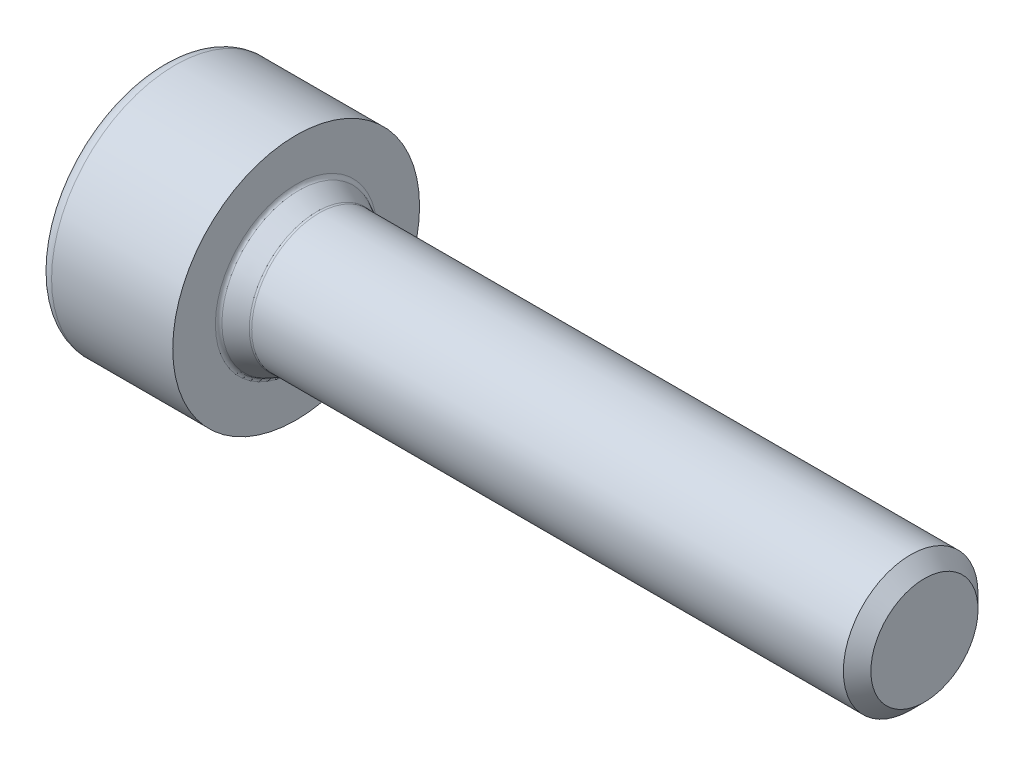
ISO-10303-21;
HEADER;
FILE_DESCRIPTION(('STEP AP214'),'2;1');
FILE_NAME('part.step','',(''),(''),'','','');
FILE_SCHEMA(('AUTOMOTIVE_DESIGN { 1 0 10303 214 1 1 1 1 }'));
ENDSEC;
DATA;
#1=APPLICATION_CONTEXT('core data for automotive mechanical design processes');
#2=APPLICATION_PROTOCOL_DEFINITION('international standard','automotive_design',2000,#1);
#3=PRODUCT_CONTEXT('',#1,'mechanical');
#4=PRODUCT('Part','Part','',(#3));
#5=PRODUCT_RELATED_PRODUCT_CATEGORY('part','',(#4));
#6=PRODUCT_DEFINITION_FORMATION('','',#4);
#7=PRODUCT_DEFINITION_CONTEXT('part definition',#1,'design');
#8=PRODUCT_DEFINITION('design','',#6,#7);
#9=PRODUCT_DEFINITION_SHAPE('','',#8);
#10=(LENGTH_UNIT() NAMED_UNIT(*) SI_UNIT(.MILLI.,.METRE.));
#11=(NAMED_UNIT(*) PLANE_ANGLE_UNIT() SI_UNIT($,.RADIAN.));
#12=(NAMED_UNIT(*) SI_UNIT($,.STERADIAN.) SOLID_ANGLE_UNIT());
#13=UNCERTAINTY_MEASURE_WITH_UNIT(LENGTH_MEASURE(1.E-05),#10,'distance_accuracy_value','');
#14=(GEOMETRIC_REPRESENTATION_CONTEXT(3) GLOBAL_UNCERTAINTY_ASSIGNED_CONTEXT((#13)) GLOBAL_UNIT_ASSIGNED_CONTEXT((#10,
#11,#12)) REPRESENTATION_CONTEXT('',''));
#15=CARTESIAN_POINT('',(0.,0.,0.));
#16=DIRECTION('',(0.,0.,1.));
#17=DIRECTION('',(1.,0.,0.));
#18=AXIS2_PLACEMENT_3D('',#15,#16,#17);
#19=CARTESIAN_POINT('',(-2.906936506234,0.,0.));
#20=DIRECTION('',(-1.,0.,0.));
#21=DIRECTION('',(0.,1.,0.));
#22=AXIS2_PLACEMENT_3D('',#19,#20,#21);
#23=CONICAL_SURFACE('',#22,1.341936506234,0.7853981633973);
#24=CARTESIAN_POINT('',(-3.,0.,0.));
#25=DIRECTION('',(1.,0.,0.));
#26=DIRECTION('',(0.,0.999947983062032,0.0101995671561903));
#27=AXIS2_PLACEMENT_3D('',#24,#25,#26);
#28=CIRCLE('',#27,1.435);
#29=CARTESIAN_POINT('',(-2.99999999999997,1.43492535569397,0.0146363788690873));
#30=VERTEX_POINT('',#29);
#31=CARTESIAN_POINT('',(-3.00000000000003,0.730138153767151,1.23536362113084));
#32=VERTEX_POINT('',#31);
#33=EDGE_CURVE('E39',#30,#32,#28,.T.);
#34=ORIENTED_EDGE('',*,*,#33,.F.);
#35=CARTESIAN_POINT('',(-2.99999999999994,1.43492535569392,0.0146363788691689));
#36=CARTESIAN_POINT('',(-2.97614422371731,1.4106193387093,0.0567356352161698));
#37=CARTESIAN_POINT('',(-2.95372895412203,1.3859120209074,0.0995299649677996));
#38=CARTESIAN_POINT('',(-2.91275824022247,1.33556014658678,0.186741969547446));
#39=CARTESIAN_POINT('',(-2.89422444683699,1.30991122427724,0.231167206146955));
#40=CARTESIAN_POINT('',(-2.86251893335503,1.25819744031708,0.320738107417589));
#41=CARTESIAN_POINT('',(-2.84927080540438,1.23214462501469,0.365862907201519));
#42=CARTESIAN_POINT('',(-2.82890288182361,1.17948997052263,0.457063444036758));
#43=CARTESIAN_POINT('',(-2.8217687788494,1.15288956308333,0.503136701223658));
#44=CARTESIAN_POINT('',(-2.81531818802178,1.10662680515254,0.583266148458035));
#45=CARTESIAN_POINT('',(-2.81441787119777,1.08701763674572,0.61723022443282));
#46=CARTESIAN_POINT('',(-2.81631201720629,1.0478383652373,0.685090713288938));
#47=CARTESIAN_POINT('',(-2.81910735787764,1.02826827252343,0.718987108178199));
#48=CARTESIAN_POINT('',(-2.82823104116125,0.989322680674852,0.786442851990769));
#49=CARTESIAN_POINT('',(-2.83456230528465,0.969947355958469,0.820001898812687));
#50=CARTESIAN_POINT('',(-2.85041837521561,0.93152258447923,0.886555555283951));
#51=CARTESIAN_POINT('',(-2.85994451238738,0.912473277057983,0.919549923586548));
#52=CARTESIAN_POINT('',(-2.88717720356657,0.865404269275559,1.00107583652756));
#53=CARTESIAN_POINT('',(-2.90659584019148,0.837635822931904,1.04917219644202));
#54=CARTESIAN_POINT('',(-2.95013015718396,0.783131175530099,1.14357701499056));
#55=CARTESIAN_POINT('',(-2.97423015988034,0.756391876451996,1.18989083955262));
#56=CARTESIAN_POINT('',(-2.99999999999998,0.730138153766981,1.23536362113088));
#57=B_SPLINE_CURVE_WITH_KNOTS('',3,(#35,#36,#37,#38,#39,#40,#41,#42,#43,#44,#45,#46,#47,#48,#49,
#50,#51,#52,#53,#54,#55,#56),.UNSPECIFIED.,.F.,.F.,(4,2,2,2,2,2,2,2,2,2,4),(0.,0.16255676109417,
0.325997439622727,0.486981513142126,0.647587833358023,0.765107082730972,0.882654251762948,
1.00029868661831,1.11799220718218,1.29422884383595,1.46988514298333),.UNSPECIFIED.);
#58=EDGE_CURVE('E11',#30,#32,#57,.T.);
#59=ORIENTED_EDGE('',*,*,#58,.T.);
#60=EDGE_LOOP('',(#34,#59));
#61=FACE_BOUND('',#60,.T.);
#62=ADVANCED_FACE('F17',(#61),#23,.F.);
#63=CARTESIAN_POINT('',(-1.15,1.443375672974,0.));
#64=DIRECTION('',(0.,0.866025403784429,0.500000000000017));
#65=DIRECTION('',(0.,0.500000000000017,-0.866025403784429));
#66=AXIS2_PLACEMENT_3D('',#63,#64,#65);
#67=PLANE('',#66);
#68=DIRECTION('',(1.,0.,0.));
#69=VECTOR('',#68,1.);
#70=CARTESIAN_POINT('',(-3.,1.443375672974,0.));
#71=LINE('',#70,#69);
#72=CARTESIAN_POINT('',(-3.,1.443375672974,0.));
#73=VERTEX_POINT('',#72);
#74=CARTESIAN_POINT('',(-1.15,1.443375672974,0.));
#75=VERTEX_POINT('',#74);
#76=EDGE_CURVE('E32',#73,#75,#71,.T.);
#77=ORIENTED_EDGE('',*,*,#76,.T.);
#78=DIRECTION('',(0.,0.500000000000017,-0.866025403784429));
#79=VECTOR('',#78,1.);
#80=CARTESIAN_POINT('',(-1.15,0.721687836487,1.25));
#81=LINE('',#80,#79);
#82=CARTESIAN_POINT('',(-1.15,0.721687836487,1.25));
#83=VERTEX_POINT('',#82);
#84=EDGE_CURVE('E321',#83,#75,#81,.T.);
#85=ORIENTED_EDGE('',*,*,#84,.F.);
#86=DIRECTION('',(1.,0.,0.));
#87=VECTOR('',#86,1.);
#88=CARTESIAN_POINT('',(-3.,0.721687836487,1.25));
#89=LINE('',#88,#87);
#90=CARTESIAN_POINT('',(-3.,0.721687836487,1.25));
#91=VERTEX_POINT('',#90);
#92=EDGE_CURVE('E261',#91,#83,#89,.T.);
#93=ORIENTED_EDGE('',*,*,#92,.F.);
#94=DIRECTION('',(0.,-0.500000000002111,0.86602540378322));
#95=VECTOR('',#94,1.);
#96=CARTESIAN_POINT('',(-3.,0.7301381537672,1.235363621131));
#97=LINE('',#96,#95);
#98=EDGE_CURVE('E264',#32,#91,#97,.T.);
#99=ORIENTED_EDGE('',*,*,#98,.F.);
#100=ORIENTED_EDGE('',*,*,#58,.F.);
#101=DIRECTION('',(0.,-0.499999999997804,0.866025403785707));
#102=VECTOR('',#101,1.);
#103=CARTESIAN_POINT('',(-3.,1.443375672974,0.));
#104=LINE('',#103,#102);
#105=EDGE_CURVE('E245',#73,#30,#104,.T.);
#106=ORIENTED_EDGE('',*,*,#105,.F.);
#107=EDGE_LOOP('',(#77,#85,#93,#99,#100,#106));
#108=FACE_BOUND('',#107,.T.);
#109=ADVANCED_FACE('F136',(#108),#67,.F.);
#110=CARTESIAN_POINT('',(-3.,1.9425,0.));
#111=DIRECTION('',(-1.,0.,0.));
#112=DIRECTION('',(0.,1.,0.));
#113=AXIS2_PLACEMENT_3D('',#110,#111,#112);
#114=PLANE('',#113);
#115=CARTESIAN_POINT('',(-3.,0.,0.));
#116=DIRECTION('',(-1.,0.,0.));
#117=DIRECTION('',(0.,0.,-1.));
#118=AXIS2_PLACEMENT_3D('',#115,#116,#117);
#119=CIRCLE('',#118,2.45);
#120=CARTESIAN_POINT('',(-3.,0.,-2.45));
#121=VERTEX_POINT('',#120);
#122=EDGE_CURVE('E220',#121,#121,#119,.T.);
#123=ORIENTED_EDGE('',*,*,#122,.T.);
#124=EDGE_LOOP('',(#123));
#125=FACE_BOUND('',#124,.T.);
#126=DIRECTION('',(0.,-1.,2.469989252602E-12));
#127=VECTOR('',#126,1.);
#128=CARTESIAN_POINT('',(-3.,-0.7047872019268,-1.25));
#129=LINE('',#128,#127);
#130=CARTESIAN_POINT('',(-3.00000000000003,-0.704787201926908,-1.25));
#131=VERTEX_POINT('',#130);
#132=CARTESIAN_POINT('',(-3.,-0.721687836487,-1.25));
#133=VERTEX_POINT('',#132);
#134=EDGE_CURVE('E96',#131,#133,#129,.T.);
#135=ORIENTED_EDGE('',*,*,#134,.F.);
#136=CARTESIAN_POINT('',(-3.,0.,0.));
#137=DIRECTION('',(1.,0.,0.));
#138=DIRECTION('',(0.,-0.491140907266199,-0.871080139372799));
#139=AXIS2_PLACEMENT_3D('',#136,#137,#138);
#140=CIRCLE('',#139,1.435);
#141=CARTESIAN_POINT('',(-3.,0.70478720192687,-1.25000000000002));
#142=VERTEX_POINT('',#141);
#143=EDGE_CURVE('E223',#131,#142,#140,.T.);
#144=ORIENTED_EDGE('',*,*,#143,.T.);
#145=DIRECTION('',(0.,-1.,-2.430574530486E-12));
#146=VECTOR('',#145,1.);
#147=CARTESIAN_POINT('',(-3.,0.721687836487,-1.25));
#148=LINE('',#147,#146);
#149=CARTESIAN_POINT('',(-3.,0.721687836487,-1.25));
#150=VERTEX_POINT('',#149);
#151=EDGE_CURVE('E224',#150,#142,#148,.T.);
#152=ORIENTED_EDGE('',*,*,#151,.F.);
#153=DIRECTION('',(0.,0.500000000002111,0.86602540378322));
#154=VECTOR('',#153,1.);
#155=CARTESIAN_POINT('',(-3.,0.721687836487,-1.25));
#156=LINE('',#155,#154);
#157=CARTESIAN_POINT('',(-3.,0.730138153767082,-1.23536362113086));
#158=VERTEX_POINT('',#157);
#159=EDGE_CURVE('E227',#150,#158,#156,.T.);
#160=ORIENTED_EDGE('',*,*,#159,.T.);
#161=CARTESIAN_POINT('',(-3.,0.,0.));
#162=DIRECTION('',(1.,0.,0.));
#163=DIRECTION('',(0.,0.508807075795911,-0.860880572216619));
#164=AXIS2_PLACEMENT_3D('',#161,#162,#163);
#165=CIRCLE('',#164,1.435);
#166=CARTESIAN_POINT('',(-3.,1.434925355694,-0.0146363788691958));
#167=VERTEX_POINT('',#166);
#168=EDGE_CURVE('E238',#158,#167,#165,.T.);
#169=ORIENTED_EDGE('',*,*,#168,.T.);
#170=DIRECTION('',(0.,0.499999999997804,0.866025403785707));
#171=VECTOR('',#170,1.);
#172=CARTESIAN_POINT('',(-3.,1.434925355694,-0.01463637886925));
#173=LINE('',#172,#171);
#174=EDGE_CURVE('E241',#167,#73,#173,.T.);
#175=ORIENTED_EDGE('',*,*,#174,.T.);
#176=ORIENTED_EDGE('',*,*,#105,.T.);
#177=ORIENTED_EDGE('',*,*,#33,.T.);
#178=ORIENTED_EDGE('',*,*,#98,.T.);
#179=DIRECTION('',(0.,1.,-2.469989252602E-12));
#180=VECTOR('',#179,1.);
#181=CARTESIAN_POINT('',(-3.,0.7047872019268,1.25));
#182=LINE('',#181,#180);
#183=CARTESIAN_POINT('',(-3.00000000000003,0.704787201926908,1.25));
#184=VERTEX_POINT('',#183);
#185=EDGE_CURVE('E257',#184,#91,#182,.T.);
#186=ORIENTED_EDGE('',*,*,#185,.F.);
#187=CARTESIAN_POINT('',(-3.,0.,0.));
#188=DIRECTION('',(1.,0.,0.));
#189=DIRECTION('',(0.,0.491140907266199,0.871080139372799));
#190=AXIS2_PLACEMENT_3D('',#187,#188,#189);
#191=CIRCLE('',#190,1.435);
#192=CARTESIAN_POINT('',(-3.,-0.704787201926871,1.25000000000002));
#193=VERTEX_POINT('',#192);
#194=EDGE_CURVE('E253',#184,#193,#191,.T.);
#195=ORIENTED_EDGE('',*,*,#194,.T.);
#196=DIRECTION('',(0.,1.,2.417436289781E-12));
#197=VECTOR('',#196,1.);
#198=CARTESIAN_POINT('',(-3.,-0.721687836487,1.25));
#199=LINE('',#198,#197);
#200=CARTESIAN_POINT('',(-3.,-0.721687836487,1.25));
#201=VERTEX_POINT('',#200);
#202=EDGE_CURVE('E265',#201,#193,#199,.T.);
#203=ORIENTED_EDGE('',*,*,#202,.F.);
#204=DIRECTION('',(0.,-0.500000000002111,-0.86602540378322));
#205=VECTOR('',#204,1.);
#206=CARTESIAN_POINT('',(-3.,-0.721687836487,1.25));
#207=LINE('',#206,#205);
#208=CARTESIAN_POINT('',(-3.,-0.730138153767082,1.23536362113086));
#209=VERTEX_POINT('',#208);
#210=EDGE_CURVE('E249',#201,#209,#207,.T.);
#211=ORIENTED_EDGE('',*,*,#210,.T.);
#212=CARTESIAN_POINT('',(-3.,0.,0.));
#213=DIRECTION('',(1.,0.,0.));
#214=DIRECTION('',(0.,-0.508807075795911,0.860880572216619));
#215=AXIS2_PLACEMENT_3D('',#212,#213,#214);
#216=CIRCLE('',#215,1.435);
#217=CARTESIAN_POINT('',(-3.,-1.434925355694,0.0146363788691958));
#218=VERTEX_POINT('',#217);
#219=EDGE_CURVE('E246',#209,#218,#216,.T.);
#220=ORIENTED_EDGE('',*,*,#219,.T.);
#221=DIRECTION('',(0.,-0.499999999997804,-0.866025403785707));
#222=VECTOR('',#221,1.);
#223=CARTESIAN_POINT('',(-3.,-1.434925355694,0.01463637886925));
#224=LINE('',#223,#222);
#225=CARTESIAN_POINT('',(-3.,-1.443375672974,0.));
#226=VERTEX_POINT('',#225);
#227=EDGE_CURVE('E250',#218,#226,#224,.T.);
#228=ORIENTED_EDGE('',*,*,#227,.T.);
#229=DIRECTION('',(0.,0.499999999997804,-0.866025403785707));
#230=VECTOR('',#229,1.);
#231=CARTESIAN_POINT('',(-3.,-1.443375672974,0.));
#232=LINE('',#231,#230);
#233=CARTESIAN_POINT('',(-3.,-1.434925355694,-0.0146363788690752));
#234=VERTEX_POINT('',#233);
#235=EDGE_CURVE('E256',#226,#234,#232,.T.);
#236=ORIENTED_EDGE('',*,*,#235,.T.);
#237=CARTESIAN_POINT('',(-3.,0.,0.));
#238=DIRECTION('',(1.,0.,0.));
#239=DIRECTION('',(0.,-0.999947983062032,-0.0101995671561903));
#240=AXIS2_PLACEMENT_3D('',#237,#238,#239);
#241=CIRCLE('',#240,1.435);
#242=CARTESIAN_POINT('',(-3.,-0.730138153767165,-1.23536362113081));
#243=VERTEX_POINT('',#242);
#244=EDGE_CURVE('E79',#234,#243,#241,.T.);
#245=ORIENTED_EDGE('',*,*,#244,.T.);
#246=DIRECTION('',(0.,0.500000000002111,-0.86602540378322));
#247=VECTOR('',#246,1.);
#248=CARTESIAN_POINT('',(-3.,-0.7301381537672,-1.235363621131));
#249=LINE('',#248,#247);
#250=EDGE_CURVE('E89',#243,#133,#249,.T.);
#251=ORIENTED_EDGE('',*,*,#250,.T.);
#252=EDGE_LOOP('',(#135,#144,#152,#160,#169,#175,#176,#177,#178,#186,#195,#203,#211,#220,#228,
#236,#245,#251));
#253=FACE_BOUND('',#252,.T.);
#254=ADVANCED_FACE('F141',(#125,#253),#114,.T.);
#255=CARTESIAN_POINT('',(-2.7,0.,0.));
#256=DIRECTION('',(-1.,0.,0.));
#257=DIRECTION('',(0.,0.,1.));
#258=AXIS2_PLACEMENT_3D('',#255,#256,#257);
#259=TOROIDAL_SURFACE('',#258,2.45,0.3);
#260=CARTESIAN_POINT('',(-2.7,0.,0.));
#261=DIRECTION('',(-1.,0.,0.));
#262=DIRECTION('',(0.,0.,1.));
#263=AXIS2_PLACEMENT_3D('',#260,#261,#262);
#264=CIRCLE('',#263,2.75);
#265=CARTESIAN_POINT('',(-2.7,0.,2.75));
#266=VERTEX_POINT('',#265);
#267=EDGE_CURVE('E503',#266,#266,#264,.T.);
#268=ORIENTED_EDGE('',*,*,#267,.T.);
#269=EDGE_LOOP('',(#268));
#270=FACE_BOUND('',#269,.T.);
#271=ORIENTED_EDGE('',*,*,#122,.F.);
#272=EDGE_LOOP('',(#271));
#273=FACE_BOUND('',#272,.T.);
#274=ADVANCED_FACE('F209',(#270,#273),#259,.T.);
#275=CARTESIAN_POINT('',(-1.35,0.,0.));
#276=DIRECTION('',(1.,0.,0.));
#277=DIRECTION('',(0.,1.,0.));
#278=AXIS2_PLACEMENT_3D('',#275,#276,#277);
#279=CYLINDRICAL_SURFACE('',#278,2.75);
#280=CARTESIAN_POINT('',(0.,0.,0.));
#281=DIRECTION('',(1.,0.,0.));
#282=DIRECTION('',(0.,1.,0.));
#283=AXIS2_PLACEMENT_3D('',#280,#281,#282);
#284=CIRCLE('',#283,2.75);
#285=CARTESIAN_POINT('',(0.,2.75,0.));
#286=VERTEX_POINT('',#285);
#287=EDGE_CURVE('E506',#286,#286,#284,.T.);
#288=ORIENTED_EDGE('',*,*,#287,.F.);
#289=EDGE_LOOP('',(#288));
#290=FACE_BOUND('',#289,.T.);
#291=ORIENTED_EDGE('',*,*,#267,.F.);
#292=EDGE_LOOP('',(#291));
#293=FACE_BOUND('',#292,.T.);
#294=ADVANCED_FACE('F205',(#290,#293),#279,.T.);
#295=CARTESIAN_POINT('',(0.,2.275,0.));
#296=DIRECTION('',(1.,0.,0.));
#297=DIRECTION('',(0.,-1.,0.));
#298=AXIS2_PLACEMENT_3D('',#295,#296,#297);
#299=PLANE('',#298);
#300=ORIENTED_EDGE('',*,*,#287,.T.);
#301=EDGE_LOOP('',(#300));
#302=FACE_BOUND('',#301,.T.);
#303=CARTESIAN_POINT('',(0.,0.,0.));
#304=DIRECTION('',(-1.,0.,0.));
#305=DIRECTION('',(0.,0.,-1.));
#306=AXIS2_PLACEMENT_3D('',#303,#304,#305);
#307=CIRCLE('',#306,1.8);
#308=CARTESIAN_POINT('',(0.,0.,-1.8));
#309=VERTEX_POINT('',#308);
#310=EDGE_CURVE('E509',#309,#309,#307,.T.);
#311=ORIENTED_EDGE('',*,*,#310,.T.);
#312=EDGE_LOOP('',(#311));
#313=FACE_BOUND('',#312,.T.);
#314=ADVANCED_FACE('F201',(#302,#313),#299,.T.);
#315=CARTESIAN_POINT('',(0.1,0.,0.));
#316=DIRECTION('',(-1.,0.,0.));
#317=DIRECTION('',(0.,0.,1.));
#318=AXIS2_PLACEMENT_3D('',#315,#316,#317);
#319=TOROIDAL_SURFACE('',#318,1.8,0.1);
#320=CARTESIAN_POINT('',(0.05615763679786,0.,0.));
#321=DIRECTION('',(-1.,0.,0.));
#322=DIRECTION('',(0.,0.,1.));
#323=AXIS2_PLACEMENT_3D('',#320,#321,#322);
#324=CIRCLE('',#323,1.710123155436);
#325=CARTESIAN_POINT('',(0.05615763679786,0.,1.710123155436));
#326=VERTEX_POINT('',#325);
#327=EDGE_CURVE('E512',#326,#326,#324,.T.);
#328=ORIENTED_EDGE('',*,*,#327,.T.);
#329=EDGE_LOOP('',(#328));
#330=FACE_BOUND('',#329,.T.);
#331=ORIENTED_EDGE('',*,*,#310,.F.);
#332=EDGE_LOOP('',(#331));
#333=FACE_BOUND('',#332,.T.);
#334=ADVANCED_FACE('F197',(#330,#333),#319,.F.);
#335=CARTESIAN_POINT('',(0.2611576367979,0.,0.));
#336=DIRECTION('',(-1.,0.,0.));
#337=DIRECTION('',(0.,1.,0.));
#338=AXIS2_PLACEMENT_3D('',#335,#336,#337);
#339=CONICAL_SURFACE('',#338,1.610123155436,0.453844001521399);
#340=CARTESIAN_POINT('',(0.4661576367979,0.,0.));
#341=DIRECTION('',(1.,0.,0.));
#342=DIRECTION('',(0.,0.,1.));
#343=AXIS2_PLACEMENT_3D('',#340,#341,#342);
#344=CIRCLE('',#343,1.510123155436);
#345=CARTESIAN_POINT('',(0.4661576367979,0.,1.510123155436));
#346=VERTEX_POINT('',#345);
#347=EDGE_CURVE('E516',#346,#346,#344,.T.);
#348=ORIENTED_EDGE('',*,*,#347,.F.);
#349=EDGE_LOOP('',(#348));
#350=FACE_BOUND('',#349,.T.);
#351=ORIENTED_EDGE('',*,*,#327,.F.);
#352=EDGE_LOOP('',(#351));
#353=FACE_BOUND('',#352,.T.);
#354=ADVANCED_FACE('F193',(#350,#353),#339,.T.);
#355=CARTESIAN_POINT('',(0.51,0.,0.));
#356=DIRECTION('',(-1.,0.,0.));
#357=DIRECTION('',(0.,0.,1.));
#358=AXIS2_PLACEMENT_3D('',#355,#356,#357);
#359=TOROIDAL_SURFACE('',#358,1.6,0.1);
#360=CARTESIAN_POINT('',(0.51,0.,0.));
#361=DIRECTION('',(-1.,0.,0.));
#362=DIRECTION('',(0.,0.,-1.));
#363=AXIS2_PLACEMENT_3D('',#360,#361,#362);
#364=CIRCLE('',#363,1.5);
#365=CARTESIAN_POINT('',(0.51,0.,-1.5));
#366=VERTEX_POINT('',#365);
#367=EDGE_CURVE('E515',#366,#366,#364,.T.);
#368=ORIENTED_EDGE('',*,*,#367,.T.);
#369=EDGE_LOOP('',(#368));
#370=FACE_BOUND('',#369,.T.);
#371=ORIENTED_EDGE('',*,*,#347,.T.);
#372=EDGE_LOOP('',(#371));
#373=FACE_BOUND('',#372,.T.);
#374=ADVANCED_FACE('F189',(#370,#373),#359,.F.);
#375=CARTESIAN_POINT('',(7.10175,0.,0.));
#376=DIRECTION('',(1.,0.,0.));
#377=DIRECTION('',(0.,1.,0.));
#378=AXIS2_PLACEMENT_3D('',#375,#376,#377);
#379=CYLINDRICAL_SURFACE('',#378,1.5);
#380=CARTESIAN_POINT('',(13.6935,0.,0.));
#381=DIRECTION('',(1.,0.,0.));
#382=DIRECTION('',(0.,-1.,0.));
#383=AXIS2_PLACEMENT_3D('',#380,#381,#382);
#384=CIRCLE('',#383,1.5);
#385=CARTESIAN_POINT('',(13.6935,-1.5,0.));
#386=VERTEX_POINT('',#385);
#387=EDGE_CURVE('E308',#386,#386,#384,.T.);
#388=ORIENTED_EDGE('',*,*,#387,.F.);
#389=EDGE_LOOP('',(#388));
#390=FACE_BOUND('',#389,.T.);
#391=ORIENTED_EDGE('',*,*,#367,.F.);
#392=EDGE_LOOP('',(#391));
#393=FACE_BOUND('',#392,.T.);
#394=ADVANCED_FACE('F185',(#390,#393),#379,.T.);
#395=CARTESIAN_POINT('',(13.84675,0.,0.));
#396=DIRECTION('',(-1.,0.,0.));
#397=DIRECTION('',(0.,1.,0.));
#398=AXIS2_PLACEMENT_3D('',#395,#396,#397);
#399=CONICAL_SURFACE('',#398,1.34675,0.7853981633973);
#400=CARTESIAN_POINT('',(14.,0.,0.));
#401=DIRECTION('',(1.,0.,0.));
#402=DIRECTION('',(0.,1.,0.));
#403=AXIS2_PLACEMENT_3D('',#400,#401,#402);
#404=CIRCLE('',#403,1.1935);
#405=CARTESIAN_POINT('',(14.,1.1935,0.));
#406=VERTEX_POINT('',#405);
#407=EDGE_CURVE('E305',#406,#406,#404,.T.);
#408=ORIENTED_EDGE('',*,*,#407,.F.);
#409=EDGE_LOOP('',(#408));
#410=FACE_BOUND('',#409,.T.);
#411=ORIENTED_EDGE('',*,*,#387,.T.);
#412=EDGE_LOOP('',(#411));
#413=FACE_BOUND('',#412,.T.);
#414=ADVANCED_FACE('F181',(#410,#413),#399,.T.);
#415=CARTESIAN_POINT('',(14.,0.59675,0.));
#416=DIRECTION('',(1.,0.,0.));
#417=DIRECTION('',(0.,-1.,0.));
#418=AXIS2_PLACEMENT_3D('',#415,#416,#417);
#419=PLANE('',#418);
#420=ORIENTED_EDGE('',*,*,#407,.T.);
#421=EDGE_LOOP('',(#420));
#422=FACE_BOUND('',#421,.T.);
#423=ADVANCED_FACE('F178',(#422),#419,.T.);
#424=CARTESIAN_POINT('',(-1.15,-1.443375672974,0.));
#425=DIRECTION('',(0.,-0.866025403784429,-0.500000000000017));
#426=DIRECTION('',(0.,-0.500000000000017,0.866025403784429));
#427=AXIS2_PLACEMENT_3D('',#424,#425,#426);
#428=PLANE('',#427);
#429=CARTESIAN_POINT('',(-2.99999999999994,-1.43492535569392,-0.0146363788691689));
#430=CARTESIAN_POINT('',(-2.97614422371731,-1.4106193387093,-0.0567356352161698));
#431=CARTESIAN_POINT('',(-2.95372895412203,-1.3859120209074,-0.0995299649677996));
#432=CARTESIAN_POINT('',(-2.91275824022247,-1.33556014658678,-0.186741969547446));
#433=CARTESIAN_POINT('',(-2.89422444683699,-1.30991122427724,-0.231167206146955));
#434=CARTESIAN_POINT('',(-2.86251893335503,-1.25819744031708,-0.320738107417589));
#435=CARTESIAN_POINT('',(-2.84927080540438,-1.23214462501469,-0.365862907201519));
#436=CARTESIAN_POINT('',(-2.82890288182361,-1.17948997052263,-0.457063444036758));
#437=CARTESIAN_POINT('',(-2.8217687788494,-1.15288956308333,-0.503136701223658));
#438=CARTESIAN_POINT('',(-2.81531818802178,-1.10662680515254,-0.583266148458035));
#439=CARTESIAN_POINT('',(-2.81441787119777,-1.08701763674572,-0.61723022443282));
#440=CARTESIAN_POINT('',(-2.81631201720629,-1.0478383652373,-0.685090713288938));
#441=CARTESIAN_POINT('',(-2.81910735787764,-1.02826827252343,-0.718987108178199));
#442=CARTESIAN_POINT('',(-2.82823104116125,-0.989322680674852,-0.786442851990769));
#443=CARTESIAN_POINT('',(-2.83456230528465,-0.969947355958469,-0.820001898812687));
#444=CARTESIAN_POINT('',(-2.85041837521561,-0.93152258447923,-0.886555555283951));
#445=CARTESIAN_POINT('',(-2.85994451238738,-0.912473277057983,-0.919549923586548));
#446=CARTESIAN_POINT('',(-2.88717720356657,-0.865404269275559,-1.00107583652756));
#447=CARTESIAN_POINT('',(-2.90659584019148,-0.837635822931904,-1.04917219644202));
#448=CARTESIAN_POINT('',(-2.95013015718396,-0.783131175530099,-1.14357701499056));
#449=CARTESIAN_POINT('',(-2.97423015988034,-0.756391876451996,-1.18989083955262));
#450=CARTESIAN_POINT('',(-2.99999999999998,-0.730138153766981,-1.23536362113088));
#451=B_SPLINE_CURVE_WITH_KNOTS('',3,(#429,#430,#431,#432,#433,#434,#435,#436,#437,#438,#439,
#440,#441,#442,#443,#444,#445,#446,#447,#448,#449,#450),.UNSPECIFIED.,.F.,.F.,(4,2,2,2,2,2,2,2,
2,2,4),(0.,0.16255676109417,0.325997439622727,0.486981513142126,0.647587833358023,
0.765107082730972,0.882654251762948,1.00029868661831,1.11799220718218,1.29422884383595,
1.46988514298333),.UNSPECIFIED.);
#452=EDGE_CURVE('E22',#234,#243,#451,.T.);
#453=ORIENTED_EDGE('',*,*,#452,.F.);
#454=ORIENTED_EDGE('',*,*,#235,.F.);
#455=DIRECTION('',(1.,0.,0.));
#456=VECTOR('',#455,1.);
#457=CARTESIAN_POINT('',(-3.,-1.443375672974,0.));
#458=LINE('',#457,#456);
#459=CARTESIAN_POINT('',(-1.15,-1.443375672974,0.));
#460=VERTEX_POINT('',#459);
#461=EDGE_CURVE('E235',#226,#460,#458,.T.);
#462=ORIENTED_EDGE('',*,*,#461,.T.);
#463=DIRECTION('',(0.,-0.500000000000017,0.866025403784429));
#464=VECTOR('',#463,1.);
#465=CARTESIAN_POINT('',(-1.15,-0.721687836487,-1.25));
#466=LINE('',#465,#464);
#467=CARTESIAN_POINT('',(-1.15,-0.721687836487,-1.25));
#468=VERTEX_POINT('',#467);
#469=EDGE_CURVE('E312',#468,#460,#466,.T.);
#470=ORIENTED_EDGE('',*,*,#469,.F.);
#471=DIRECTION('',(1.,0.,0.));
#472=VECTOR('',#471,1.);
#473=CARTESIAN_POINT('',(-3.,-0.721687836487,-1.25));
#474=LINE('',#473,#472);
#475=EDGE_CURVE('E233',#133,#468,#474,.T.);
#476=ORIENTED_EDGE('',*,*,#475,.F.);
#477=ORIENTED_EDGE('',*,*,#250,.F.);
#478=EDGE_LOOP('',(#453,#454,#462,#470,#476,#477));
#479=FACE_BOUND('',#478,.T.);
#480=ADVANCED_FACE('F174',(#479),#428,.F.);
#481=CARTESIAN_POINT('',(-1.15,-0.721687836487,-1.25));
#482=DIRECTION('',(0.,0.,-1.));
#483=DIRECTION('',(0.,-1.,0.));
#484=AXIS2_PLACEMENT_3D('',#481,#482,#483);
#485=PLANE('',#484);
#486=ORIENTED_EDGE('',*,*,#475,.T.);
#487=DIRECTION('',(0.,-1.,0.));
#488=VECTOR('',#487,1.);
#489=CARTESIAN_POINT('',(-1.15,0.721687836487,-1.25));
#490=LINE('',#489,#488);
#491=CARTESIAN_POINT('',(-1.15,0.721687836487,-1.25));
#492=VERTEX_POINT('',#491);
#493=EDGE_CURVE('E313',#492,#468,#490,.T.);
#494=ORIENTED_EDGE('',*,*,#493,.F.);
#495=DIRECTION('',(1.,0.,0.));
#496=VECTOR('',#495,1.);
#497=CARTESIAN_POINT('',(-3.,0.721687836487,-1.25));
#498=LINE('',#497,#496);
#499=EDGE_CURVE('E161',#150,#492,#498,.T.);
#500=ORIENTED_EDGE('',*,*,#499,.F.);
#501=ORIENTED_EDGE('',*,*,#151,.T.);
#502=CARTESIAN_POINT('',(-2.99999999999997,-0.704787201926816,-1.25));
#503=CARTESIAN_POINT('',(-2.97614422371734,-0.65617516795757,-1.25));
#504=CARTESIAN_POINT('',(-2.95372895412207,-0.606760532353786,-1.25));
#505=CARTESIAN_POINT('',(-2.91275824022252,-0.506056783712539,-1.25));
#506=CARTESIAN_POINT('',(-2.89422444683705,-0.454758939093463,-1.25));
#507=CARTESIAN_POINT('',(-2.86251893335509,-0.351331371173153,-1.25));
#508=CARTESIAN_POINT('',(-2.84927080540444,-0.299225740568397,-1.25));
#509=CARTESIAN_POINT('',(-2.82890288182367,-0.193916431584276,-1.25));
#510=CARTESIAN_POINT('',(-2.82176877884946,-0.140715616705679,-1.25));
#511=CARTESIAN_POINT('',(-2.81531818802185,-0.0481901008441125,-1.25));
#512=CARTESIAN_POINT('',(-2.81441787119784,-0.0089717640304725,-1.25));
#513=CARTESIAN_POINT('',(-2.81631201720636,0.0693867789863707,-1.25));
#514=CARTESIAN_POINT('',(-2.81910735787771,0.108526964414118,-1.25));
#515=CARTESIAN_POINT('',(-2.82823104116132,0.186418148111271,-1.25));
#516=CARTESIAN_POINT('',(-2.83456230528472,0.225168797544037,-1.25));
#517=CARTESIAN_POINT('',(-2.85041837521568,0.302018340502517,-1.25));
#518=CARTESIAN_POINT('',(-2.85994451238745,0.340116955345012,-1.25));
#519=CARTESIAN_POINT('',(-2.88717720356664,0.434254970909824,-1.25));
#520=CARTESIAN_POINT('',(-2.90659584019153,0.489791863597099,-1.25));
#521=CARTESIAN_POINT('',(-2.95013015718399,0.598801158400642,-1.25));
#522=CARTESIAN_POINT('',(-2.97423015988034,0.652279756556817,-1.25));
#523=CARTESIAN_POINT('',(-2.99999999999997,0.704787201926816,-1.25));
#524=B_SPLINE_CURVE_WITH_KNOTS('',3,(#502,#503,#504,#505,#506,#507,#508,#509,#510,#511,#512,
#513,#514,#515,#516,#517,#518,#519,#520,#521,#522,#523),.UNSPECIFIED.,.F.,.F.,(4,2,2,2,2,2,2,2,
2,2,4),(0.,0.162556761094158,0.325997439622702,0.486981513142088,0.647587833357973,
0.765107082730929,0.882654251762911,1.00029868661828,1.11799220718216,1.29422884383582,
1.46988514298309),.UNSPECIFIED.);
#525=EDGE_CURVE('E153',#131,#142,#524,.T.);
#526=ORIENTED_EDGE('',*,*,#525,.F.);
#527=ORIENTED_EDGE('',*,*,#134,.T.);
#528=EDGE_LOOP('',(#486,#494,#500,#501,#526,#527));
#529=FACE_BOUND('',#528,.T.);
#530=ADVANCED_FACE('F171',(#529),#485,.F.);
#531=CARTESIAN_POINT('',(-2.906936506234,0.,0.));
#532=DIRECTION('',(-1.,0.,0.));
#533=DIRECTION('',(0.,1.,0.));
#534=AXIS2_PLACEMENT_3D('',#531,#532,#533);
#535=CONICAL_SURFACE('',#534,1.341936506234,0.7853981633973);
#536=ORIENTED_EDGE('',*,*,#143,.F.);
#537=ORIENTED_EDGE('',*,*,#525,.T.);
#538=EDGE_LOOP('',(#536,#537));
#539=FACE_BOUND('',#538,.T.);
#540=ADVANCED_FACE('F169',(#539),#535,.F.);
#541=CARTESIAN_POINT('',(-1.15,0.721687836487,-1.25));
#542=DIRECTION('',(0.,0.866025403784429,-0.500000000000017));
#543=DIRECTION('',(0.,-0.500000000000017,-0.866025403784429));
#544=AXIS2_PLACEMENT_3D('',#541,#542,#543);
#545=PLANE('',#544);
#546=ORIENTED_EDGE('',*,*,#499,.T.);
#547=DIRECTION('',(0.,-0.500000000000017,-0.866025403784429));
#548=VECTOR('',#547,1.);
#549=CARTESIAN_POINT('',(-1.15,1.443375672974,0.));
#550=LINE('',#549,#548);
#551=EDGE_CURVE('E317',#75,#492,#550,.T.);
#552=ORIENTED_EDGE('',*,*,#551,.F.);
#553=ORIENTED_EDGE('',*,*,#76,.F.);
#554=ORIENTED_EDGE('',*,*,#174,.F.);
#555=CARTESIAN_POINT('',(-3.00000000000002,0.730138153767039,-1.2353636211309));
#556=CARTESIAN_POINT('',(-2.97614422371739,0.754444170751667,-1.19326436478389));
#557=CARTESIAN_POINT('',(-2.95372895412211,0.779151488553563,-1.15047003503226));
#558=CARTESIAN_POINT('',(-2.91275824022255,0.829503362874196,-1.0632580304526));
#559=CARTESIAN_POINT('',(-2.89422444683706,0.855152285183739,-1.01883279385309));
#560=CARTESIAN_POINT('',(-2.86251893335509,0.906866069143904,-0.929261892582447));
#561=CARTESIAN_POINT('',(-2.84927080540444,0.932918884446287,-0.884137092798512));
#562=CARTESIAN_POINT('',(-2.82890288182367,0.985573538938359,-0.792936555963264));
#563=CARTESIAN_POINT('',(-2.82176877884945,1.01217394637766,-0.746863298776358));
#564=CARTESIAN_POINT('',(-2.81531818802183,1.05843670430845,-0.666733851541975));
#565=CARTESIAN_POINT('',(-2.81441787119782,1.07804587271527,-0.632769775567188));
#566=CARTESIAN_POINT('',(-2.81631201720634,1.1172251442237,-0.564909286711067));
#567=CARTESIAN_POINT('',(-2.81910735787769,1.13679523693757,-0.531012891821805));
#568=CARTESIAN_POINT('',(-2.82823104116131,1.17574082878615,-0.463557148009231));
#569=CARTESIAN_POINT('',(-2.8345623052847,1.19511615350253,-0.429998101187312));
#570=CARTESIAN_POINT('',(-2.85041837521566,1.23354092498177,-0.363444444716045));
#571=CARTESIAN_POINT('',(-2.85994451238743,1.25259023240302,-0.330450076413446));
#572=CARTESIAN_POINT('',(-2.88717720356662,1.29965924018543,-0.248924163472454));
#573=CARTESIAN_POINT('',(-2.90659584019152,1.32742768652908,-0.200827803558014));
#574=CARTESIAN_POINT('',(-2.95013015718398,1.38193233393086,-0.1064229850095));
#575=CARTESIAN_POINT('',(-2.97423015988034,1.40867163300896,-0.0601091604474645));
#576=CARTESIAN_POINT('',(-2.99999999999997,1.43492535569396,-0.0146363788692136));
#577=B_SPLINE_CURVE_WITH_KNOTS('',3,(#555,#556,#557,#558,#559,#560,#561,#562,#563,#564,#565,
#566,#567,#568,#569,#570,#571,#572,#573,#574,#575,#576),.UNSPECIFIED.,.F.,.F.,(4,2,2,2,2,2,2,2,
2,2,4),(0.,0.162556761094187,0.32599743962276,0.486981513142176,0.64758783335809,
0.765107082731045,0.882654251763027,1.00029868661839,1.11799220718227,1.29422884383597,
1.46988514298328),.UNSPECIFIED.);
#578=EDGE_CURVE('E162',#158,#167,#577,.T.);
#579=ORIENTED_EDGE('',*,*,#578,.F.);
#580=ORIENTED_EDGE('',*,*,#159,.F.);
#581=EDGE_LOOP('',(#546,#552,#553,#554,#579,#580));
#582=FACE_BOUND('',#581,.T.);
#583=ADVANCED_FACE('F345',(#582),#545,.F.);
#584=CARTESIAN_POINT('',(-2.906936506234,0.,0.));
#585=DIRECTION('',(-1.,0.,0.));
#586=DIRECTION('',(0.,1.,0.));
#587=AXIS2_PLACEMENT_3D('',#584,#585,#586);
#588=CONICAL_SURFACE('',#587,1.341936506234,0.7853981633973);
#589=ORIENTED_EDGE('',*,*,#168,.F.);
#590=ORIENTED_EDGE('',*,*,#578,.T.);
#591=EDGE_LOOP('',(#589,#590));
#592=FACE_BOUND('',#591,.T.);
#593=ADVANCED_FACE('F349',(#592),#588,.F.);
#594=CARTESIAN_POINT('',(-1.15,0.,0.));
#595=DIRECTION('',(1.,0.,0.));
#596=DIRECTION('',(0.,0.,-1.));
#597=AXIS2_PLACEMENT_3D('',#594,#595,#596);
#598=PLANE('',#597);
#599=ORIENTED_EDGE('',*,*,#84,.T.);
#600=ORIENTED_EDGE('',*,*,#551,.T.);
#601=ORIENTED_EDGE('',*,*,#493,.T.);
#602=ORIENTED_EDGE('',*,*,#469,.T.);
#603=DIRECTION('',(0.,0.500000000000017,0.866025403784429));
#604=VECTOR('',#603,1.);
#605=CARTESIAN_POINT('',(-1.15,-1.443375672974,0.));
#606=LINE('',#605,#604);
#607=CARTESIAN_POINT('',(-1.15,-0.721687836487,1.25));
#608=VERTEX_POINT('',#607);
#609=EDGE_CURVE('E304',#460,#608,#606,.T.);
#610=ORIENTED_EDGE('',*,*,#609,.T.);
#611=DIRECTION('',(0.,1.,0.));
#612=VECTOR('',#611,1.);
#613=CARTESIAN_POINT('',(-1.15,-0.721687836487,1.25));
#614=LINE('',#613,#612);
#615=EDGE_CURVE('E118',#608,#83,#614,.T.);
#616=ORIENTED_EDGE('',*,*,#615,.T.);
#617=EDGE_LOOP('',(#599,#600,#601,#602,#610,#616));
#618=FACE_BOUND('',#617,.T.);
#619=CARTESIAN_POINT('',(-1.15,0.,0.));
#620=DIRECTION('',(1.,0.,0.));
#621=DIRECTION('',(0.,1.,0.));
#622=AXIS2_PLACEMENT_3D('',#619,#620,#621);
#623=CIRCLE('',#622,1.190476190476);
#624=CARTESIAN_POINT('',(-1.15,1.190476190476,0.));
#625=VERTEX_POINT('',#624);
#626=EDGE_CURVE('E260',#625,#625,#623,.T.);
#627=ORIENTED_EDGE('',*,*,#626,.T.);
#628=EDGE_LOOP('',(#627));
#629=FACE_BOUND('',#628,.T.);
#630=ADVANCED_FACE('F291',(#618,#629),#598,.F.);
#631=CARTESIAN_POINT('',(-1.15,0.721687836487,1.25));
#632=DIRECTION('',(0.,0.,1.));
#633=DIRECTION('',(0.,1.,0.));
#634=AXIS2_PLACEMENT_3D('',#631,#632,#633);
#635=PLANE('',#634);
#636=CARTESIAN_POINT('',(-2.99999999999997,0.704787201926816,1.25));
#637=CARTESIAN_POINT('',(-2.97614422371734,0.65617516795757,1.25));
#638=CARTESIAN_POINT('',(-2.95372895412207,0.606760532353786,1.25));
#639=CARTESIAN_POINT('',(-2.91275824022252,0.506056783712539,1.25));
#640=CARTESIAN_POINT('',(-2.89422444683705,0.454758939093463,1.25));
#641=CARTESIAN_POINT('',(-2.86251893335509,0.351331371173153,1.25));
#642=CARTESIAN_POINT('',(-2.84927080540444,0.299225740568397,1.25));
#643=CARTESIAN_POINT('',(-2.82890288182367,0.193916431584276,1.25));
#644=CARTESIAN_POINT('',(-2.82176877884946,0.140715616705679,1.25));
#645=CARTESIAN_POINT('',(-2.81531818802185,0.0481901008441125,1.25));
#646=CARTESIAN_POINT('',(-2.81441787119784,0.0089717640304725,1.25));
#647=CARTESIAN_POINT('',(-2.81631201720636,-0.0693867789863707,1.25));
#648=CARTESIAN_POINT('',(-2.81910735787771,-0.108526964414118,1.25));
#649=CARTESIAN_POINT('',(-2.82823104116132,-0.186418148111271,1.25));
#650=CARTESIAN_POINT('',(-2.83456230528472,-0.225168797544037,1.25));
#651=CARTESIAN_POINT('',(-2.85041837521568,-0.302018340502517,1.25));
#652=CARTESIAN_POINT('',(-2.85994451238745,-0.340116955345012,1.25));
#653=CARTESIAN_POINT('',(-2.88717720356664,-0.434254970909824,1.25));
#654=CARTESIAN_POINT('',(-2.90659584019153,-0.489791863597099,1.25));
#655=CARTESIAN_POINT('',(-2.95013015718399,-0.598801158400642,1.25));
#656=CARTESIAN_POINT('',(-2.97423015988034,-0.652279756556817,1.25));
#657=CARTESIAN_POINT('',(-2.99999999999997,-0.704787201926816,1.25));
#658=B_SPLINE_CURVE_WITH_KNOTS('',3,(#636,#637,#638,#639,#640,#641,#642,#643,#644,#645,#646,
#647,#648,#649,#650,#651,#652,#653,#654,#655,#656,#657),.UNSPECIFIED.,.F.,.F.,(4,2,2,2,2,2,2,2,
2,2,4),(0.,0.162556761094158,0.325997439622702,0.486981513142088,0.647587833357973,
0.765107082730929,0.882654251762911,1.00029868661828,1.11799220718216,1.29422884383582,
1.46988514298309),.UNSPECIFIED.);
#659=EDGE_CURVE('E270',#184,#193,#658,.T.);
#660=ORIENTED_EDGE('',*,*,#659,.F.);
#661=ORIENTED_EDGE('',*,*,#185,.T.);
#662=ORIENTED_EDGE('',*,*,#92,.T.);
#663=ORIENTED_EDGE('',*,*,#615,.F.);
#664=DIRECTION('',(1.,0.,0.));
#665=VECTOR('',#664,1.);
#666=CARTESIAN_POINT('',(-3.,-0.721687836487,1.25));
#667=LINE('',#666,#665);
#668=EDGE_CURVE('E267',#201,#608,#667,.T.);
#669=ORIENTED_EDGE('',*,*,#668,.F.);
#670=ORIENTED_EDGE('',*,*,#202,.T.);
#671=EDGE_LOOP('',(#660,#661,#662,#663,#669,#670));
#672=FACE_BOUND('',#671,.T.);
#673=ADVANCED_FACE('F286',(#672),#635,.F.);
#674=CARTESIAN_POINT('',(-1.15,-0.721687836487,1.25));
#675=DIRECTION('',(0.,-0.866025403784429,0.500000000000017));
#676=DIRECTION('',(0.,0.500000000000017,0.866025403784429));
#677=AXIS2_PLACEMENT_3D('',#674,#675,#676);
#678=PLANE('',#677);
#679=CARTESIAN_POINT('',(-3.00000000000002,-0.730138153767039,1.2353636211309));
#680=CARTESIAN_POINT('',(-2.97614422371739,-0.754444170751667,1.19326436478389));
#681=CARTESIAN_POINT('',(-2.95372895412211,-0.779151488553563,1.15047003503226));
#682=CARTESIAN_POINT('',(-2.91275824022255,-0.829503362874196,1.0632580304526));
#683=CARTESIAN_POINT('',(-2.89422444683706,-0.855152285183739,1.01883279385309));
#684=CARTESIAN_POINT('',(-2.86251893335509,-0.906866069143904,0.929261892582447));
#685=CARTESIAN_POINT('',(-2.84927080540444,-0.932918884446287,0.884137092798512));
#686=CARTESIAN_POINT('',(-2.82890288182367,-0.985573538938359,0.792936555963264));
#687=CARTESIAN_POINT('',(-2.82176877884945,-1.01217394637766,0.746863298776358));
#688=CARTESIAN_POINT('',(-2.81531818802183,-1.05843670430845,0.666733851541975));
#689=CARTESIAN_POINT('',(-2.81441787119782,-1.07804587271527,0.632769775567188));
#690=CARTESIAN_POINT('',(-2.81631201720634,-1.1172251442237,0.564909286711067));
#691=CARTESIAN_POINT('',(-2.81910735787769,-1.13679523693757,0.531012891821805));
#692=CARTESIAN_POINT('',(-2.82823104116131,-1.17574082878615,0.463557148009231));
#693=CARTESIAN_POINT('',(-2.8345623052847,-1.19511615350253,0.429998101187312));
#694=CARTESIAN_POINT('',(-2.85041837521566,-1.23354092498177,0.363444444716045));
#695=CARTESIAN_POINT('',(-2.85994451238743,-1.25259023240302,0.330450076413446));
#696=CARTESIAN_POINT('',(-2.88717720356662,-1.29965924018543,0.248924163472454));
#697=CARTESIAN_POINT('',(-2.90659584019152,-1.32742768652908,0.200827803558014));
#698=CARTESIAN_POINT('',(-2.95013015718398,-1.38193233393086,0.1064229850095));
#699=CARTESIAN_POINT('',(-2.97423015988034,-1.40867163300896,0.0601091604474645));
#700=CARTESIAN_POINT('',(-2.99999999999997,-1.43492535569396,0.0146363788692136));
#701=B_SPLINE_CURVE_WITH_KNOTS('',3,(#679,#680,#681,#682,#683,#684,#685,#686,#687,#688,#689,
#690,#691,#692,#693,#694,#695,#696,#697,#698,#699,#700),.UNSPECIFIED.,.F.,.F.,(4,2,2,2,2,2,2,2,
2,2,4),(0.,0.162556761094187,0.32599743962276,0.486981513142176,0.64758783335809,
0.765107082731045,0.882654251763027,1.00029868661839,1.11799220718227,1.29422884383597,
1.46988514298328),.UNSPECIFIED.);
#702=EDGE_CURVE('E272',#209,#218,#701,.T.);
#703=ORIENTED_EDGE('',*,*,#702,.F.);
#704=ORIENTED_EDGE('',*,*,#210,.F.);
#705=ORIENTED_EDGE('',*,*,#668,.T.);
#706=ORIENTED_EDGE('',*,*,#609,.F.);
#707=ORIENTED_EDGE('',*,*,#461,.F.);
#708=ORIENTED_EDGE('',*,*,#227,.F.);
#709=EDGE_LOOP('',(#703,#704,#705,#706,#707,#708));
#710=FACE_BOUND('',#709,.T.);
#711=ADVANCED_FACE('F290',(#710),#678,.F.);
#712=CARTESIAN_POINT('',(-2.906936506234,0.,0.));
#713=DIRECTION('',(-1.,0.,0.));
#714=DIRECTION('',(0.,1.,0.));
#715=AXIS2_PLACEMENT_3D('',#712,#713,#714);
#716=CONICAL_SURFACE('',#715,1.341936506234,0.7853981633973);
#717=ORIENTED_EDGE('',*,*,#219,.F.);
#718=ORIENTED_EDGE('',*,*,#702,.T.);
#719=EDGE_LOOP('',(#717,#718));
#720=FACE_BOUND('',#719,.T.);
#721=ADVANCED_FACE('F131',(#720),#716,.F.);
#722=CARTESIAN_POINT('',(-2.906936506234,0.,0.));
#723=DIRECTION('',(-1.,0.,0.));
#724=DIRECTION('',(0.,1.,0.));
#725=AXIS2_PLACEMENT_3D('',#722,#723,#724);
#726=CONICAL_SURFACE('',#725,1.341936506234,0.7853981633973);
#727=ORIENTED_EDGE('',*,*,#194,.F.);
#728=ORIENTED_EDGE('',*,*,#659,.T.);
#729=EDGE_LOOP('',(#727,#728));
#730=FACE_BOUND('',#729,.T.);
#731=ADVANCED_FACE('F124',(#730),#726,.F.);
#732=CARTESIAN_POINT('',(-0.8132123429727,0.,0.));
#733=DIRECTION('',(-1.,0.,0.));
#734=DIRECTION('',(0.,1.,0.));
#735=AXIS2_PLACEMENT_3D('',#732,#733,#734);
#736=CONICAL_SURFACE('',#735,0.6071428571429,1.0471975511964);
#737=ORIENTED_EDGE('',*,*,#626,.F.);
#738=EDGE_LOOP('',(#737));
#739=FACE_BOUND('',#738,.T.);
#740=CARTESIAN_POINT('',(-0.4626782509647,0.,0.));
#741=VERTEX_POINT('',#740);
#742=VERTEX_LOOP('',#741);
#743=FACE_BOUND('',#742,.T.);
#744=ADVANCED_FACE('F122',(#739,#743),#736,.F.);
#745=CARTESIAN_POINT('',(-2.906936506234,0.,0.));
#746=DIRECTION('',(-1.,0.,0.));
#747=DIRECTION('',(0.,1.,0.));
#748=AXIS2_PLACEMENT_3D('',#745,#746,#747);
#749=CONICAL_SURFACE('',#748,1.341936506234,0.7853981633973);
#750=ORIENTED_EDGE('',*,*,#244,.F.);
#751=ORIENTED_EDGE('',*,*,#452,.T.);
#752=EDGE_LOOP('',(#750,#751));
#753=FACE_BOUND('',#752,.T.);
#754=ADVANCED_FACE('F19',(#753),#749,.F.);
#755=CLOSED_SHELL('',(#62,#109,#254,#274,#294,#314,#334,#354,#374,#394,#414,#423,#480,#530,#540,
#583,#593,#630,#673,#711,#721,#731,#744,#754));
#756=MANIFOLD_SOLID_BREP('B1',#755);
#757=ADVANCED_BREP_SHAPE_REPRESENTATION('',(#18,#756),#14);
#758=SHAPE_DEFINITION_REPRESENTATION(#9,#757);
ENDSEC;
END-ISO-10303-21;
